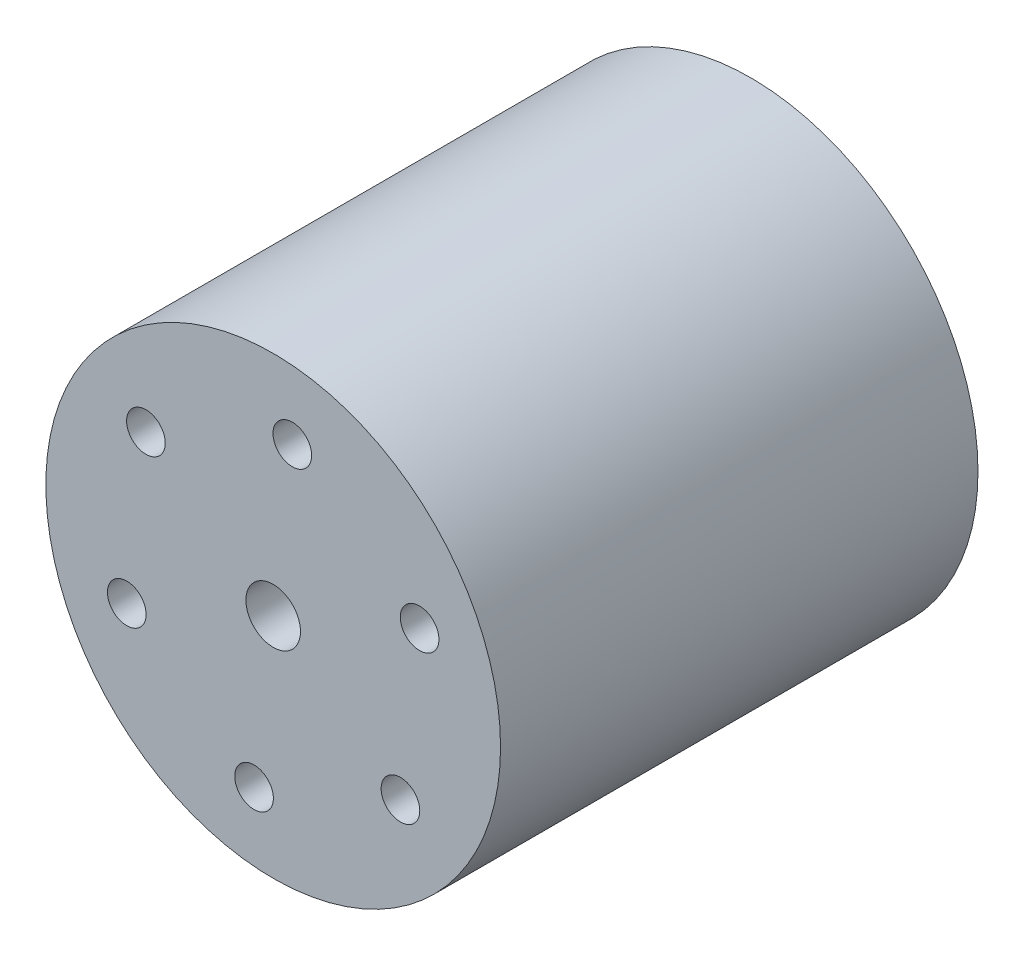
ISO-10303-21;
HEADER;
FILE_DESCRIPTION(('STEP AP214'),'2;1');
FILE_NAME('part.step','',(''),(''),'','','');
FILE_SCHEMA(('AUTOMOTIVE_DESIGN { 1 0 10303 214 1 1 1 1 }'));
ENDSEC;
DATA;
#1=APPLICATION_CONTEXT('core data for automotive mechanical design processes');
#2=APPLICATION_PROTOCOL_DEFINITION('international standard','automotive_design',2000,#1);
#3=PRODUCT_CONTEXT('',#1,'mechanical');
#4=PRODUCT('Part','Part','',(#3));
#5=PRODUCT_RELATED_PRODUCT_CATEGORY('part','',(#4));
#6=PRODUCT_DEFINITION_FORMATION('','',#4);
#7=PRODUCT_DEFINITION_CONTEXT('part definition',#1,'design');
#8=PRODUCT_DEFINITION('design','',#6,#7);
#9=PRODUCT_DEFINITION_SHAPE('','',#8);
#10=(LENGTH_UNIT() NAMED_UNIT(*) SI_UNIT(.MILLI.,.METRE.));
#11=(NAMED_UNIT(*) PLANE_ANGLE_UNIT() SI_UNIT($,.RADIAN.));
#12=(NAMED_UNIT(*) SI_UNIT($,.STERADIAN.) SOLID_ANGLE_UNIT());
#13=UNCERTAINTY_MEASURE_WITH_UNIT(LENGTH_MEASURE(1.E-05),#10,'distance_accuracy_value','');
#14=(GEOMETRIC_REPRESENTATION_CONTEXT(3) GLOBAL_UNCERTAINTY_ASSIGNED_CONTEXT((#13)) GLOBAL_UNIT_ASSIGNED_CONTEXT((#10,
#11,#12)) REPRESENTATION_CONTEXT('',''));
#15=CARTESIAN_POINT('',(0.,0.,0.));
#16=DIRECTION('',(0.,0.,1.));
#17=DIRECTION('',(1.,0.,0.));
#18=AXIS2_PLACEMENT_3D('',#15,#16,#17);
#19=CARTESIAN_POINT('',(0.,0.,-25.4));
#20=DIRECTION('',(0.,0.,1.));
#21=DIRECTION('',(1.,0.,0.));
#22=AXIS2_PLACEMENT_3D('',#19,#20,#21);
#23=CYLINDRICAL_SURFACE('',#22,6.);
#24=CARTESIAN_POINT('',(0.,0.,-25.4));
#25=DIRECTION('',(0.,0.,-1.));
#26=DIRECTION('',(-1.,0.,0.));
#27=AXIS2_PLACEMENT_3D('',#24,#25,#26);
#28=CIRCLE('',#27,6.);
#29=CARTESIAN_POINT('',(-6.,0.,-25.4));
#30=VERTEX_POINT('',#29);
#31=EDGE_CURVE('E11',#30,#30,#28,.T.);
#32=ORIENTED_EDGE('',*,*,#31,.F.);
#33=EDGE_LOOP('',(#32));
#34=FACE_BOUND('',#33,.T.);
#35=CARTESIAN_POINT('',(0.,0.,0.));
#36=DIRECTION('',(0.,0.,-1.));
#37=DIRECTION('',(-1.,0.,0.));
#38=AXIS2_PLACEMENT_3D('',#35,#36,#37);
#39=CIRCLE('',#38,6.);
#40=CARTESIAN_POINT('',(-6.,0.,0.));
#41=VERTEX_POINT('',#40);
#42=EDGE_CURVE('E48',#41,#41,#39,.T.);
#43=ORIENTED_EDGE('',*,*,#42,.T.);
#44=EDGE_LOOP('',(#43));
#45=FACE_BOUND('',#44,.T.);
#46=ADVANCED_FACE('F45',(#34,#45),#23,.T.);
#47=CARTESIAN_POINT('',(0.,0.,-25.4));
#48=DIRECTION('',(0.,0.,-1.));
#49=DIRECTION('',(-1.,0.,0.));
#50=AXIS2_PLACEMENT_3D('',#47,#48,#49);
#51=PLANE('',#50);
#52=ORIENTED_EDGE('',*,*,#31,.T.);
#53=EDGE_LOOP('',(#52));
#54=FACE_BOUND('',#53,.T.);
#55=ADVANCED_FACE('F60',(#54),#51,.T.);
#56=CARTESIAN_POINT('',(0.,0.,0.));
#57=DIRECTION('',(0.,0.,-1.));
#58=DIRECTION('',(-1.,0.,0.));
#59=AXIS2_PLACEMENT_3D('',#56,#57,#58);
#60=PLANE('',#59);
#61=ORIENTED_EDGE('',*,*,#42,.F.);
#62=EDGE_LOOP('',(#61));
#63=FACE_BOUND('',#62,.T.);
#64=ADVANCED_FACE('F58',(#63),#60,.F.);
#65=CLOSED_SHELL('',(#46,#55,#64));
#66=MANIFOLD_SOLID_BREP('B2',#65);
#67=CARTESIAN_POINT('',(0.,0.,105.));
#68=DIRECTION('',(0.,0.,1.));
#69=DIRECTION('',(1.,0.,0.));
#70=AXIS2_PLACEMENT_3D('',#67,#68,#69);
#71=PLANE('',#70);
#72=CARTESIAN_POINT('',(-32.1957070243634,-13.7272156390638,105.));
#73=DIRECTION('',(0.,0.,1.));
#74=DIRECTION('',(1.,0.,0.));
#75=AXIS2_PLACEMENT_3D('',#72,#73,#74);
#76=CIRCLE('',#75,4.25);
#77=CARTESIAN_POINT('',(-27.9457070243634,-13.7272156390638,105.));
#78=VERTEX_POINT('',#77);
#79=EDGE_CURVE('E137',#78,#78,#76,.T.);
#80=ORIENTED_EDGE('',*,*,#79,.F.);
#81=EDGE_LOOP('',(#80));
#82=FACE_BOUND('',#81,.T.);
#83=CARTESIAN_POINT('',(27.985970978838,-21.0186923563679,105.));
#84=DIRECTION('',(0.,0.,1.));
#85=DIRECTION('',(1.,0.,0.));
#86=AXIS2_PLACEMENT_3D('',#83,#84,#85);
#87=CIRCLE('',#86,4.25);
#88=CARTESIAN_POINT('',(32.235970978838,-21.0186923563679,105.));
#89=VERTEX_POINT('',#88);
#90=EDGE_CURVE('E121',#89,#89,#87,.T.);
#91=ORIENTED_EDGE('',*,*,#90,.F.);
#92=EDGE_LOOP('',(#91));
#93=FACE_BOUND('',#92,.T.);
#94=CARTESIAN_POINT('',(-27.985970978838,21.0186923563679,105.));
#95=DIRECTION('',(0.,0.,1.));
#96=DIRECTION('',(1.,0.,0.));
#97=AXIS2_PLACEMENT_3D('',#94,#95,#96);
#98=CIRCLE('',#97,4.25);
#99=CARTESIAN_POINT('',(-23.735970978838,21.0186923563679,105.));
#100=VERTEX_POINT('',#99);
#101=EDGE_CURVE('E105',#100,#100,#98,.T.);
#102=ORIENTED_EDGE('',*,*,#101,.F.);
#103=EDGE_LOOP('',(#102));
#104=FACE_BOUND('',#103,.T.);
#105=CARTESIAN_POINT('',(0.,0.,105.));
#106=DIRECTION('',(0.,0.,1.));
#107=DIRECTION('',(1.,0.,0.));
#108=AXIS2_PLACEMENT_3D('',#105,#106,#107);
#109=CIRCLE('',#108,50.);
#110=CARTESIAN_POINT('',(50.,0.,105.));
#111=VERTEX_POINT('',#110);
#112=EDGE_CURVE('E44',#111,#111,#109,.T.);
#113=ORIENTED_EDGE('',*,*,#112,.T.);
#114=EDGE_LOOP('',(#113));
#115=FACE_BOUND('',#114,.T.);
#116=CARTESIAN_POINT('',(4.20973604552538,34.7459079954317,105.));
#117=DIRECTION('',(0.,0.,1.));
#118=DIRECTION('',(1.,0.,0.));
#119=AXIS2_PLACEMENT_3D('',#116,#117,#118);
#120=CIRCLE('',#119,4.25);
#121=CARTESIAN_POINT('',(8.45973604552538,34.7459079954317,105.));
#122=VERTEX_POINT('',#121);
#123=EDGE_CURVE('E99',#122,#122,#120,.T.);
#124=ORIENTED_EDGE('',*,*,#123,.F.);
#125=EDGE_LOOP('',(#124));
#126=FACE_BOUND('',#125,.T.);
#127=CARTESIAN_POINT('',(32.1957070243634,13.7272156390638,105.));
#128=DIRECTION('',(0.,0.,1.));
#129=DIRECTION('',(1.,0.,0.));
#130=AXIS2_PLACEMENT_3D('',#127,#128,#129);
#131=CIRCLE('',#130,4.25);
#132=CARTESIAN_POINT('',(36.4457070243634,13.7272156390638,105.));
#133=VERTEX_POINT('',#132);
#134=EDGE_CURVE('E113',#133,#133,#131,.T.);
#135=ORIENTED_EDGE('',*,*,#134,.F.);
#136=EDGE_LOOP('',(#135));
#137=FACE_BOUND('',#136,.T.);
#138=CARTESIAN_POINT('',(-4.20973604552539,-34.7459079954317,105.));
#139=DIRECTION('',(0.,0.,1.));
#140=DIRECTION('',(1.,0.,0.));
#141=AXIS2_PLACEMENT_3D('',#138,#139,#140);
#142=CIRCLE('',#141,4.25);
#143=CARTESIAN_POINT('',(0.0402639544746126,-34.7459079954317,105.));
#144=VERTEX_POINT('',#143);
#145=EDGE_CURVE('E129',#144,#144,#142,.T.);
#146=ORIENTED_EDGE('',*,*,#145,.F.);
#147=EDGE_LOOP('',(#146));
#148=FACE_BOUND('',#147,.T.);
#149=CARTESIAN_POINT('',(0.,0.,105.));
#150=DIRECTION('',(0.,0.,1.));
#151=DIRECTION('',(1.,0.,0.));
#152=AXIS2_PLACEMENT_3D('',#149,#150,#151);
#153=CIRCLE('',#152,6.);
#154=CARTESIAN_POINT('',(6.,0.,105.));
#155=VERTEX_POINT('',#154);
#156=EDGE_CURVE('E145',#155,#155,#153,.T.);
#157=ORIENTED_EDGE('',*,*,#156,.F.);
#158=EDGE_LOOP('',(#157));
#159=FACE_BOUND('',#158,.T.);
#160=ADVANCED_FACE('F86',(#82,#93,#104,#115,#126,#137,#148,#159),#71,.T.);
#161=CARTESIAN_POINT('',(0.,0.,0.));
#162=DIRECTION('',(0.,0.,1.));
#163=DIRECTION('',(1.,0.,0.));
#164=AXIS2_PLACEMENT_3D('',#161,#162,#163);
#165=PLANE('',#164);
#166=CARTESIAN_POINT('',(0.,0.,0.));
#167=DIRECTION('',(0.,0.,1.));
#168=DIRECTION('',(1.,0.,0.));
#169=AXIS2_PLACEMENT_3D('',#166,#167,#168);
#170=CIRCLE('',#169,50.);
#171=CARTESIAN_POINT('',(50.,0.,0.));
#172=VERTEX_POINT('',#171);
#173=EDGE_CURVE('E90',#172,#172,#170,.T.);
#174=ORIENTED_EDGE('',*,*,#173,.F.);
#175=EDGE_LOOP('',(#174));
#176=FACE_BOUND('',#175,.T.);
#177=CARTESIAN_POINT('',(4.20973604552538,34.7459079954317,0.));
#178=DIRECTION('',(0.,0.,1.));
#179=DIRECTION('',(1.,0.,0.));
#180=AXIS2_PLACEMENT_3D('',#177,#178,#179);
#181=CIRCLE('',#180,4.25);
#182=CARTESIAN_POINT('',(8.45973604552538,34.7459079954317,0.));
#183=VERTEX_POINT('',#182);
#184=EDGE_CURVE('E101',#183,#183,#181,.T.);
#185=ORIENTED_EDGE('',*,*,#184,.T.);
#186=EDGE_LOOP('',(#185));
#187=FACE_BOUND('',#186,.T.);
#188=CARTESIAN_POINT('',(-27.985970978838,21.0186923563679,0.));
#189=DIRECTION('',(0.,0.,1.));
#190=DIRECTION('',(1.,0.,0.));
#191=AXIS2_PLACEMENT_3D('',#188,#189,#190);
#192=CIRCLE('',#191,4.25);
#193=CARTESIAN_POINT('',(-23.735970978838,21.0186923563679,0.));
#194=VERTEX_POINT('',#193);
#195=EDGE_CURVE('E109',#194,#194,#192,.T.);
#196=ORIENTED_EDGE('',*,*,#195,.T.);
#197=EDGE_LOOP('',(#196));
#198=FACE_BOUND('',#197,.T.);
#199=CARTESIAN_POINT('',(32.1957070243634,13.7272156390638,0.));
#200=DIRECTION('',(0.,0.,1.));
#201=DIRECTION('',(1.,0.,0.));
#202=AXIS2_PLACEMENT_3D('',#199,#200,#201);
#203=CIRCLE('',#202,4.25);
#204=CARTESIAN_POINT('',(36.4457070243634,13.7272156390638,0.));
#205=VERTEX_POINT('',#204);
#206=EDGE_CURVE('E117',#205,#205,#203,.T.);
#207=ORIENTED_EDGE('',*,*,#206,.T.);
#208=EDGE_LOOP('',(#207));
#209=FACE_BOUND('',#208,.T.);
#210=CARTESIAN_POINT('',(27.985970978838,-21.0186923563679,0.));
#211=DIRECTION('',(0.,0.,1.));
#212=DIRECTION('',(1.,0.,0.));
#213=AXIS2_PLACEMENT_3D('',#210,#211,#212);
#214=CIRCLE('',#213,4.25);
#215=CARTESIAN_POINT('',(32.235970978838,-21.0186923563679,0.));
#216=VERTEX_POINT('',#215);
#217=EDGE_CURVE('E125',#216,#216,#214,.T.);
#218=ORIENTED_EDGE('',*,*,#217,.T.);
#219=EDGE_LOOP('',(#218));
#220=FACE_BOUND('',#219,.T.);
#221=CARTESIAN_POINT('',(-4.20973604552539,-34.7459079954317,0.));
#222=DIRECTION('',(0.,0.,1.));
#223=DIRECTION('',(1.,0.,0.));
#224=AXIS2_PLACEMENT_3D('',#221,#222,#223);
#225=CIRCLE('',#224,4.25);
#226=CARTESIAN_POINT('',(0.0402639544746126,-34.7459079954317,0.));
#227=VERTEX_POINT('',#226);
#228=EDGE_CURVE('E133',#227,#227,#225,.T.);
#229=ORIENTED_EDGE('',*,*,#228,.T.);
#230=EDGE_LOOP('',(#229));
#231=FACE_BOUND('',#230,.T.);
#232=CARTESIAN_POINT('',(-32.1957070243634,-13.7272156390638,0.));
#233=DIRECTION('',(0.,0.,1.));
#234=DIRECTION('',(1.,0.,0.));
#235=AXIS2_PLACEMENT_3D('',#232,#233,#234);
#236=CIRCLE('',#235,4.25);
#237=CARTESIAN_POINT('',(-27.9457070243634,-13.7272156390638,0.));
#238=VERTEX_POINT('',#237);
#239=EDGE_CURVE('E141',#238,#238,#236,.T.);
#240=ORIENTED_EDGE('',*,*,#239,.T.);
#241=EDGE_LOOP('',(#240));
#242=FACE_BOUND('',#241,.T.);
#243=CARTESIAN_POINT('',(0.,0.,0.));
#244=DIRECTION('',(0.,0.,1.));
#245=DIRECTION('',(1.,0.,0.));
#246=AXIS2_PLACEMENT_3D('',#243,#244,#245);
#247=CIRCLE('',#246,6.);
#248=CARTESIAN_POINT('',(6.,0.,0.));
#249=VERTEX_POINT('',#248);
#250=EDGE_CURVE('E149',#249,#249,#247,.T.);
#251=ORIENTED_EDGE('',*,*,#250,.T.);
#252=EDGE_LOOP('',(#251));
#253=FACE_BOUND('',#252,.T.);
#254=ADVANCED_FACE('F161',(#176,#187,#198,#209,#220,#231,#242,#253),#165,.F.);
#255=CARTESIAN_POINT('',(0.,0.,105.));
#256=DIRECTION('',(0.,0.,-1.));
#257=DIRECTION('',(-1.,0.,0.));
#258=AXIS2_PLACEMENT_3D('',#255,#256,#257);
#259=CYLINDRICAL_SURFACE('',#258,50.);
#260=ORIENTED_EDGE('',*,*,#112,.F.);
#261=EDGE_LOOP('',(#260));
#262=FACE_BOUND('',#261,.T.);
#263=ORIENTED_EDGE('',*,*,#173,.T.);
#264=EDGE_LOOP('',(#263));
#265=FACE_BOUND('',#264,.T.);
#266=ADVANCED_FACE('F88',(#262,#265),#259,.T.);
#267=CARTESIAN_POINT('',(4.20973604552538,34.7459079954317,105.));
#268=DIRECTION('',(0.,0.,-1.));
#269=DIRECTION('',(-1.,0.,0.));
#270=AXIS2_PLACEMENT_3D('',#267,#268,#269);
#271=CYLINDRICAL_SURFACE('',#270,4.25);
#272=ORIENTED_EDGE('',*,*,#123,.T.);
#273=EDGE_LOOP('',(#272));
#274=FACE_BOUND('',#273,.T.);
#275=ORIENTED_EDGE('',*,*,#184,.F.);
#276=EDGE_LOOP('',(#275));
#277=FACE_BOUND('',#276,.T.);
#278=ADVANCED_FACE('F171',(#274,#277),#271,.F.);
#279=CARTESIAN_POINT('',(-27.985970978838,21.0186923563679,105.));
#280=DIRECTION('',(0.,0.,-1.));
#281=DIRECTION('',(-1.,0.,0.));
#282=AXIS2_PLACEMENT_3D('',#279,#280,#281);
#283=CYLINDRICAL_SURFACE('',#282,4.25);
#284=ORIENTED_EDGE('',*,*,#101,.T.);
#285=EDGE_LOOP('',(#284));
#286=FACE_BOUND('',#285,.T.);
#287=ORIENTED_EDGE('',*,*,#195,.F.);
#288=EDGE_LOOP('',(#287));
#289=FACE_BOUND('',#288,.T.);
#290=ADVANCED_FACE('F174',(#286,#289),#283,.F.);
#291=CARTESIAN_POINT('',(32.1957070243634,13.7272156390638,105.));
#292=DIRECTION('',(0.,0.,-1.));
#293=DIRECTION('',(-1.,0.,0.));
#294=AXIS2_PLACEMENT_3D('',#291,#292,#293);
#295=CYLINDRICAL_SURFACE('',#294,4.25);
#296=ORIENTED_EDGE('',*,*,#134,.T.);
#297=EDGE_LOOP('',(#296));
#298=FACE_BOUND('',#297,.T.);
#299=ORIENTED_EDGE('',*,*,#206,.F.);
#300=EDGE_LOOP('',(#299));
#301=FACE_BOUND('',#300,.T.);
#302=ADVANCED_FACE('F178',(#298,#301),#295,.F.);
#303=CARTESIAN_POINT('',(27.985970978838,-21.0186923563679,105.));
#304=DIRECTION('',(0.,0.,-1.));
#305=DIRECTION('',(-1.,0.,0.));
#306=AXIS2_PLACEMENT_3D('',#303,#304,#305);
#307=CYLINDRICAL_SURFACE('',#306,4.25);
#308=ORIENTED_EDGE('',*,*,#90,.T.);
#309=EDGE_LOOP('',(#308));
#310=FACE_BOUND('',#309,.T.);
#311=ORIENTED_EDGE('',*,*,#217,.F.);
#312=EDGE_LOOP('',(#311));
#313=FACE_BOUND('',#312,.T.);
#314=ADVANCED_FACE('F182',(#310,#313),#307,.F.);
#315=CARTESIAN_POINT('',(-4.20973604552539,-34.7459079954317,105.));
#316=DIRECTION('',(0.,0.,-1.));
#317=DIRECTION('',(-1.,0.,0.));
#318=AXIS2_PLACEMENT_3D('',#315,#316,#317);
#319=CYLINDRICAL_SURFACE('',#318,4.25);
#320=ORIENTED_EDGE('',*,*,#145,.T.);
#321=EDGE_LOOP('',(#320));
#322=FACE_BOUND('',#321,.T.);
#323=ORIENTED_EDGE('',*,*,#228,.F.);
#324=EDGE_LOOP('',(#323));
#325=FACE_BOUND('',#324,.T.);
#326=ADVANCED_FACE('F186',(#322,#325),#319,.F.);
#327=CARTESIAN_POINT('',(-32.1957070243634,-13.7272156390638,105.));
#328=DIRECTION('',(0.,0.,-1.));
#329=DIRECTION('',(-1.,0.,0.));
#330=AXIS2_PLACEMENT_3D('',#327,#328,#329);
#331=CYLINDRICAL_SURFACE('',#330,4.25);
#332=ORIENTED_EDGE('',*,*,#79,.T.);
#333=EDGE_LOOP('',(#332));
#334=FACE_BOUND('',#333,.T.);
#335=ORIENTED_EDGE('',*,*,#239,.F.);
#336=EDGE_LOOP('',(#335));
#337=FACE_BOUND('',#336,.T.);
#338=ADVANCED_FACE('F190',(#334,#337),#331,.F.);
#339=CARTESIAN_POINT('',(0.,0.,105.));
#340=DIRECTION('',(0.,0.,-1.));
#341=DIRECTION('',(-1.,0.,0.));
#342=AXIS2_PLACEMENT_3D('',#339,#340,#341);
#343=CYLINDRICAL_SURFACE('',#342,6.);
#344=ORIENTED_EDGE('',*,*,#156,.T.);
#345=EDGE_LOOP('',(#344));
#346=FACE_BOUND('',#345,.T.);
#347=ORIENTED_EDGE('',*,*,#250,.F.);
#348=EDGE_LOOP('',(#347));
#349=FACE_BOUND('',#348,.T.);
#350=ADVANCED_FACE('F157',(#346,#349),#343,.F.);
#351=CLOSED_SHELL('',(#160,#254,#266,#278,#290,#302,#314,#326,#338,#350));
#352=MANIFOLD_SOLID_BREP('B6',#351);
#353=ADVANCED_BREP_SHAPE_REPRESENTATION('',(#18,#66,#352),#14);
#354=SHAPE_DEFINITION_REPRESENTATION(#9,#353);
ENDSEC;
END-ISO-10303-21;
